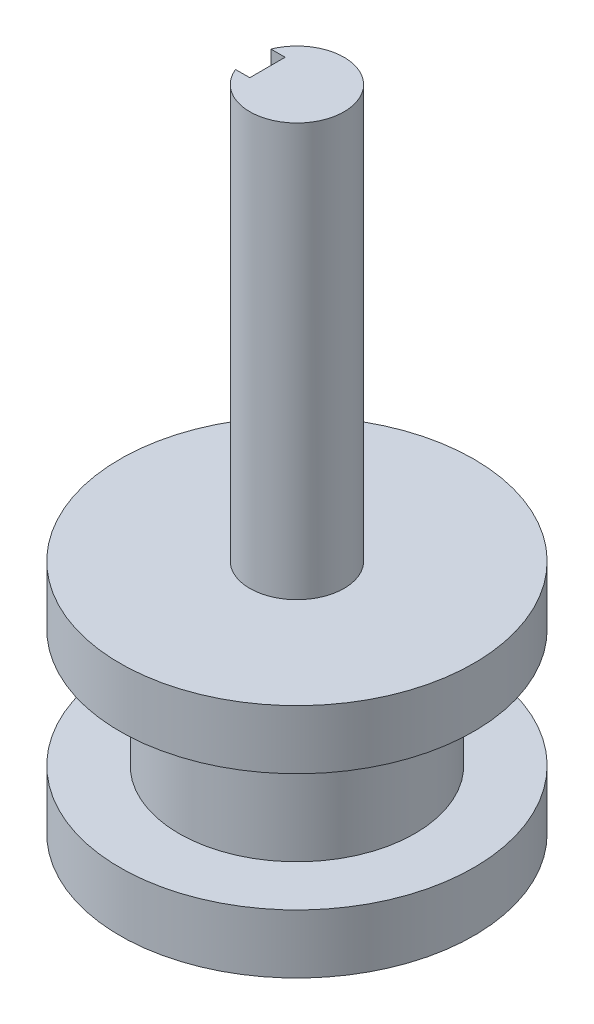
ISO-10303-21;
HEADER;
FILE_DESCRIPTION(('STEP AP214'),'2;1');
FILE_NAME('part.step','',(''),(''),'','','');
FILE_SCHEMA(('AUTOMOTIVE_DESIGN { 1 0 10303 214 1 1 1 1 }'));
ENDSEC;
DATA;
#1=APPLICATION_CONTEXT('core data for automotive mechanical design processes');
#2=APPLICATION_PROTOCOL_DEFINITION('international standard','automotive_design',2000,#1);
#3=PRODUCT_CONTEXT('',#1,'mechanical');
#4=PRODUCT('Part','Part','',(#3));
#5=PRODUCT_RELATED_PRODUCT_CATEGORY('part','',(#4));
#6=PRODUCT_DEFINITION_FORMATION('','',#4);
#7=PRODUCT_DEFINITION_CONTEXT('part definition',#1,'design');
#8=PRODUCT_DEFINITION('design','',#6,#7);
#9=PRODUCT_DEFINITION_SHAPE('','',#8);
#10=(LENGTH_UNIT() NAMED_UNIT(*) SI_UNIT(.MILLI.,.METRE.));
#11=(NAMED_UNIT(*) PLANE_ANGLE_UNIT() SI_UNIT($,.RADIAN.));
#12=(NAMED_UNIT(*) SI_UNIT($,.STERADIAN.) SOLID_ANGLE_UNIT());
#13=UNCERTAINTY_MEASURE_WITH_UNIT(LENGTH_MEASURE(1.E-05),#10,'distance_accuracy_value','');
#14=(GEOMETRIC_REPRESENTATION_CONTEXT(3) GLOBAL_UNCERTAINTY_ASSIGNED_CONTEXT((#13)) GLOBAL_UNIT_ASSIGNED_CONTEXT((#10,
#11,#12)) REPRESENTATION_CONTEXT('',''));
#15=CARTESIAN_POINT('',(0.,0.,0.));
#16=DIRECTION('',(0.,0.,1.));
#17=DIRECTION('',(1.,0.,0.));
#18=AXIS2_PLACEMENT_3D('',#15,#16,#17);
#19=CARTESIAN_POINT('',(0.,35.,0.));
#20=DIRECTION('',(0.,-1.,0.));
#21=DIRECTION('',(0.,0.,-1.));
#22=AXIS2_PLACEMENT_3D('',#19,#20,#21);
#23=CYLINDRICAL_SURFACE('',#22,4.);
#24=CARTESIAN_POINT('',(0.,35.,0.));
#25=DIRECTION('',(0.,1.,0.));
#26=DIRECTION('',(0.,0.,1.));
#27=AXIS2_PLACEMENT_3D('',#24,#25,#26);
#28=CIRCLE('',#27,4.);
#29=CARTESIAN_POINT('',(-3.70809924354783,35.,1.5));
#30=VERTEX_POINT('',#29);
#31=CARTESIAN_POINT('',(-3.70809924354783,35.,-1.5));
#32=VERTEX_POINT('',#31);
#33=EDGE_CURVE('E127',#30,#32,#28,.T.);
#34=ORIENTED_EDGE('',*,*,#33,.F.);
#35=DIRECTION('',(0.,-1.,0.));
#36=VECTOR('',#35,1.);
#37=CARTESIAN_POINT('',(-3.70809924354783,35.,1.5));
#38=LINE('',#37,#36);
#39=CARTESIAN_POINT('',(-3.70809924354783,30.,1.5));
#40=VERTEX_POINT('',#39);
#41=EDGE_CURVE('E123',#30,#40,#38,.T.);
#42=ORIENTED_EDGE('',*,*,#41,.T.);
#43=CARTESIAN_POINT('',(0.,30.,0.));
#44=DIRECTION('',(0.,1.,0.));
#45=DIRECTION('',(0.,0.,1.));
#46=AXIS2_PLACEMENT_3D('',#43,#44,#45);
#47=CIRCLE('',#46,4.);
#48=CARTESIAN_POINT('',(-3.70809924354783,30.,-1.5));
#49=VERTEX_POINT('',#48);
#50=EDGE_CURVE('E48',#49,#40,#47,.T.);
#51=ORIENTED_EDGE('',*,*,#50,.F.);
#52=DIRECTION('',(0.,-1.,0.));
#53=VECTOR('',#52,1.);
#54=CARTESIAN_POINT('',(-3.70809924354783,35.,-1.5));
#55=LINE('',#54,#53);
#56=EDGE_CURVE('E100',#49,#32,#55,.F.);
#57=ORIENTED_EDGE('',*,*,#56,.T.);
#58=EDGE_LOOP('',(#34,#42,#51,#57));
#59=FACE_BOUND('',#58,.T.);
#60=CARTESIAN_POINT('',(0.,0.,0.));
#61=DIRECTION('',(0.,1.,0.));
#62=DIRECTION('',(0.,0.,1.));
#63=AXIS2_PLACEMENT_3D('',#60,#61,#62);
#64=CIRCLE('',#63,4.);
#65=CARTESIAN_POINT('',(0.,0.,4.));
#66=VERTEX_POINT('',#65);
#67=EDGE_CURVE('E117',#66,#66,#64,.T.);
#68=ORIENTED_EDGE('',*,*,#67,.T.);
#69=EDGE_LOOP('',(#68));
#70=FACE_BOUND('',#69,.T.);
#71=ADVANCED_FACE('F45',(#59,#70),#23,.T.);
#72=CARTESIAN_POINT('',(0.,35.,0.));
#73=DIRECTION('',(0.,1.,0.));
#74=DIRECTION('',(0.,0.,1.));
#75=AXIS2_PLACEMENT_3D('',#72,#73,#74);
#76=PLANE('',#75);
#77=DIRECTION('',(1.,0.,0.));
#78=VECTOR('',#77,1.);
#79=CARTESIAN_POINT('',(0.,35.,1.5));
#80=LINE('',#79,#78);
#81=CARTESIAN_POINT('',(-2.5,35.,1.5));
#82=VERTEX_POINT('',#81);
#83=EDGE_CURVE('E131',#30,#82,#80,.T.);
#84=ORIENTED_EDGE('',*,*,#83,.F.);
#85=ORIENTED_EDGE('',*,*,#33,.T.);
#86=DIRECTION('',(-1.,0.,0.));
#87=VECTOR('',#86,1.);
#88=CARTESIAN_POINT('',(-5.5,35.,-1.5));
#89=LINE('',#88,#87);
#90=CARTESIAN_POINT('',(-2.5,35.,-1.5));
#91=VERTEX_POINT('',#90);
#92=EDGE_CURVE('E106',#91,#32,#89,.T.);
#93=ORIENTED_EDGE('',*,*,#92,.F.);
#94=DIRECTION('',(0.,0.,-1.));
#95=VECTOR('',#94,1.);
#96=CARTESIAN_POINT('',(-2.5,35.,-1.5));
#97=LINE('',#96,#95);
#98=EDGE_CURVE('E61',#82,#91,#97,.T.);
#99=ORIENTED_EDGE('',*,*,#98,.F.);
#100=EDGE_LOOP('',(#84,#85,#93,#99));
#101=FACE_BOUND('',#100,.T.);
#102=ADVANCED_FACE('F142',(#101),#76,.T.);
#103=CARTESIAN_POINT('',(0.,30.,0.));
#104=DIRECTION('',(0.,1.,0.));
#105=DIRECTION('',(0.,0.,1.));
#106=AXIS2_PLACEMENT_3D('',#103,#104,#105);
#107=PLANE('',#106);
#108=ORIENTED_EDGE('',*,*,#50,.T.);
#109=DIRECTION('',(1.,0.,0.));
#110=VECTOR('',#109,1.);
#111=CARTESIAN_POINT('',(-5.5,30.,1.5));
#112=LINE('',#111,#110);
#113=CARTESIAN_POINT('',(-2.5,30.,1.5));
#114=VERTEX_POINT('',#113);
#115=EDGE_CURVE('E95',#40,#114,#112,.T.);
#116=ORIENTED_EDGE('',*,*,#115,.T.);
#117=DIRECTION('',(0.,0.,-1.));
#118=VECTOR('',#117,1.);
#119=CARTESIAN_POINT('',(-2.5,30.,-1.5));
#120=LINE('',#119,#118);
#121=CARTESIAN_POINT('',(-2.5,30.,-1.5));
#122=VERTEX_POINT('',#121);
#123=EDGE_CURVE('E90',#114,#122,#120,.T.);
#124=ORIENTED_EDGE('',*,*,#123,.T.);
#125=DIRECTION('',(-1.,0.,0.));
#126=VECTOR('',#125,1.);
#127=CARTESIAN_POINT('',(-5.5,30.,-1.5));
#128=LINE('',#127,#126);
#129=EDGE_CURVE('E97',#122,#49,#128,.T.);
#130=ORIENTED_EDGE('',*,*,#129,.T.);
#131=EDGE_LOOP('',(#108,#116,#124,#130));
#132=FACE_BOUND('',#131,.T.);
#133=ADVANCED_FACE('F103',(#132),#107,.T.);
#134=CARTESIAN_POINT('',(-5.5,30.,1.5));
#135=DIRECTION('',(0.,0.,1.));
#136=DIRECTION('',(1.,0.,0.));
#137=AXIS2_PLACEMENT_3D('',#134,#135,#136);
#138=PLANE('',#137);
#139=ORIENTED_EDGE('',*,*,#83,.T.);
#140=DIRECTION('',(0.,1.,0.));
#141=VECTOR('',#140,1.);
#142=CARTESIAN_POINT('',(-2.5,30.,1.5));
#143=LINE('',#142,#141);
#144=EDGE_CURVE('E94',#114,#82,#143,.T.);
#145=ORIENTED_EDGE('',*,*,#144,.F.);
#146=ORIENTED_EDGE('',*,*,#115,.F.);
#147=ORIENTED_EDGE('',*,*,#41,.F.);
#148=EDGE_LOOP('',(#139,#145,#146,#147));
#149=FACE_BOUND('',#148,.T.);
#150=ADVANCED_FACE('F139',(#149),#138,.F.);
#151=CARTESIAN_POINT('',(-5.5,30.,-1.5));
#152=DIRECTION('',(0.,0.,-1.));
#153=DIRECTION('',(-1.,0.,0.));
#154=AXIS2_PLACEMENT_3D('',#151,#152,#153);
#155=PLANE('',#154);
#156=ORIENTED_EDGE('',*,*,#129,.F.);
#157=DIRECTION('',(0.,1.,0.));
#158=VECTOR('',#157,1.);
#159=CARTESIAN_POINT('',(-2.5,30.,-1.5));
#160=LINE('',#159,#158);
#161=EDGE_CURVE('E86',#122,#91,#160,.T.);
#162=ORIENTED_EDGE('',*,*,#161,.T.);
#163=ORIENTED_EDGE('',*,*,#92,.T.);
#164=ORIENTED_EDGE('',*,*,#56,.F.);
#165=EDGE_LOOP('',(#156,#162,#163,#164));
#166=FACE_BOUND('',#165,.T.);
#167=ADVANCED_FACE('F98',(#166),#155,.F.);
#168=CARTESIAN_POINT('',(-2.5,30.,-1.5));
#169=DIRECTION('',(1.,0.,0.));
#170=DIRECTION('',(0.,0.,-1.));
#171=AXIS2_PLACEMENT_3D('',#168,#169,#170);
#172=PLANE('',#171);
#173=ORIENTED_EDGE('',*,*,#98,.T.);
#174=ORIENTED_EDGE('',*,*,#161,.F.);
#175=ORIENTED_EDGE('',*,*,#123,.F.);
#176=ORIENTED_EDGE('',*,*,#144,.T.);
#177=EDGE_LOOP('',(#173,#174,#175,#176));
#178=FACE_BOUND('',#177,.T.);
#179=ADVANCED_FACE('F88',(#178),#172,.F.);
#180=CARTESIAN_POINT('',(0.,-5.,0.));
#181=DIRECTION('',(0.,1.,0.));
#182=DIRECTION('',(0.,0.,1.));
#183=AXIS2_PLACEMENT_3D('',#180,#181,#182);
#184=CYLINDRICAL_SURFACE('',#183,15.);
#185=CARTESIAN_POINT('',(0.,-5.,0.));
#186=DIRECTION('',(0.,-1.,0.));
#187=DIRECTION('',(0.,0.,-1.));
#188=AXIS2_PLACEMENT_3D('',#185,#186,#187);
#189=CIRCLE('',#188,15.);
#190=CARTESIAN_POINT('',(0.,-5.,-15.));
#191=VERTEX_POINT('',#190);
#192=EDGE_CURVE('E134',#191,#191,#189,.T.);
#193=ORIENTED_EDGE('',*,*,#192,.F.);
#194=EDGE_LOOP('',(#193));
#195=FACE_BOUND('',#194,.T.);
#196=CARTESIAN_POINT('',(0.,0.,0.));
#197=DIRECTION('',(0.,-1.,0.));
#198=DIRECTION('',(0.,0.,-1.));
#199=AXIS2_PLACEMENT_3D('',#196,#197,#198);
#200=CIRCLE('',#199,15.);
#201=CARTESIAN_POINT('',(0.,0.,-15.));
#202=VERTEX_POINT('',#201);
#203=EDGE_CURVE('E111',#202,#202,#200,.T.);
#204=ORIENTED_EDGE('',*,*,#203,.T.);
#205=EDGE_LOOP('',(#204));
#206=FACE_BOUND('',#205,.T.);
#207=ADVANCED_FACE('F195',(#195,#206),#184,.T.);
#208=CARTESIAN_POINT('',(0.,-5.,0.));
#209=DIRECTION('',(0.,-1.,0.));
#210=DIRECTION('',(0.,0.,-1.));
#211=AXIS2_PLACEMENT_3D('',#208,#209,#210);
#212=PLANE('',#211);
#213=CARTESIAN_POINT('',(0.,-5.,0.));
#214=DIRECTION('',(0.,-1.,0.));
#215=DIRECTION('',(0.,0.,-1.));
#216=AXIS2_PLACEMENT_3D('',#213,#214,#215);
#217=CIRCLE('',#216,10.);
#218=CARTESIAN_POINT('',(0.,-5.,-10.));
#219=VERTEX_POINT('',#218);
#220=EDGE_CURVE('E11',#219,#219,#217,.T.);
#221=ORIENTED_EDGE('',*,*,#220,.F.);
#222=EDGE_LOOP('',(#221));
#223=FACE_BOUND('',#222,.T.);
#224=ORIENTED_EDGE('',*,*,#192,.T.);
#225=EDGE_LOOP('',(#224));
#226=FACE_BOUND('',#225,.T.);
#227=ADVANCED_FACE('F152',(#223,#226),#212,.T.);
#228=CARTESIAN_POINT('',(0.,0.,0.));
#229=DIRECTION('',(0.,-1.,0.));
#230=DIRECTION('',(0.,0.,-1.));
#231=AXIS2_PLACEMENT_3D('',#228,#229,#230);
#232=PLANE('',#231);
#233=ORIENTED_EDGE('',*,*,#67,.F.);
#234=EDGE_LOOP('',(#233));
#235=FACE_BOUND('',#234,.T.);
#236=ORIENTED_EDGE('',*,*,#203,.F.);
#237=EDGE_LOOP('',(#236));
#238=FACE_BOUND('',#237,.T.);
#239=ADVANCED_FACE('F148',(#235,#238),#232,.F.);
#240=CARTESIAN_POINT('',(0.,-15.,0.));
#241=DIRECTION('',(0.,1.,0.));
#242=DIRECTION('',(0.,0.,1.));
#243=AXIS2_PLACEMENT_3D('',#240,#241,#242);
#244=CYLINDRICAL_SURFACE('',#243,10.);
#245=CARTESIAN_POINT('',(0.,-15.,0.));
#246=DIRECTION('',(0.,-1.,0.));
#247=DIRECTION('',(0.,0.,-1.));
#248=AXIS2_PLACEMENT_3D('',#245,#246,#247);
#249=CIRCLE('',#248,10.);
#250=CARTESIAN_POINT('',(0.,-15.,-10.));
#251=VERTEX_POINT('',#250);
#252=EDGE_CURVE('E158',#251,#251,#249,.T.);
#253=ORIENTED_EDGE('',*,*,#252,.F.);
#254=EDGE_LOOP('',(#253));
#255=FACE_BOUND('',#254,.T.);
#256=ORIENTED_EDGE('',*,*,#220,.T.);
#257=EDGE_LOOP('',(#256));
#258=FACE_BOUND('',#257,.T.);
#259=ADVANCED_FACE('F151',(#255,#258),#244,.T.);
#260=CARTESIAN_POINT('',(0.,-20.,0.));
#261=DIRECTION('',(0.,1.,0.));
#262=DIRECTION('',(0.,0.,1.));
#263=AXIS2_PLACEMENT_3D('',#260,#261,#262);
#264=CYLINDRICAL_SURFACE('',#263,15.);
#265=CARTESIAN_POINT('',(0.,-20.,0.));
#266=DIRECTION('',(0.,-1.,0.));
#267=DIRECTION('',(0.,0.,-1.));
#268=AXIS2_PLACEMENT_3D('',#265,#266,#267);
#269=CIRCLE('',#268,15.);
#270=CARTESIAN_POINT('',(0.,-20.,-15.));
#271=VERTEX_POINT('',#270);
#272=EDGE_CURVE('E163',#271,#271,#269,.T.);
#273=ORIENTED_EDGE('',*,*,#272,.F.);
#274=EDGE_LOOP('',(#273));
#275=FACE_BOUND('',#274,.T.);
#276=CARTESIAN_POINT('',(0.,-15.,0.));
#277=DIRECTION('',(0.,-1.,0.));
#278=DIRECTION('',(0.,0.,-1.));
#279=AXIS2_PLACEMENT_3D('',#276,#277,#278);
#280=CIRCLE('',#279,15.);
#281=CARTESIAN_POINT('',(0.,-15.,-15.));
#282=VERTEX_POINT('',#281);
#283=EDGE_CURVE('E169',#282,#282,#280,.T.);
#284=ORIENTED_EDGE('',*,*,#283,.T.);
#285=EDGE_LOOP('',(#284));
#286=FACE_BOUND('',#285,.T.);
#287=ADVANCED_FACE('F176',(#275,#286),#264,.T.);
#288=CARTESIAN_POINT('',(0.,-20.,0.));
#289=DIRECTION('',(0.,-1.,0.));
#290=DIRECTION('',(0.,0.,-1.));
#291=AXIS2_PLACEMENT_3D('',#288,#289,#290);
#292=PLANE('',#291);
#293=ORIENTED_EDGE('',*,*,#272,.T.);
#294=EDGE_LOOP('',(#293));
#295=FACE_BOUND('',#294,.T.);
#296=ADVANCED_FACE('F180',(#295),#292,.T.);
#297=CARTESIAN_POINT('',(0.,-15.,0.));
#298=DIRECTION('',(0.,-1.,0.));
#299=DIRECTION('',(0.,0.,-1.));
#300=AXIS2_PLACEMENT_3D('',#297,#298,#299);
#301=PLANE('',#300);
#302=ORIENTED_EDGE('',*,*,#252,.T.);
#303=EDGE_LOOP('',(#302));
#304=FACE_BOUND('',#303,.T.);
#305=ORIENTED_EDGE('',*,*,#283,.F.);
#306=EDGE_LOOP('',(#305));
#307=FACE_BOUND('',#306,.T.);
#308=ADVANCED_FACE('F178',(#304,#307),#301,.F.);
#309=CLOSED_SHELL('',(#71,#102,#133,#150,#167,#179,#207,#227,#239,#259,#287,#296,#308));
#310=MANIFOLD_SOLID_BREP('B2',#309);
#311=ADVANCED_BREP_SHAPE_REPRESENTATION('',(#18,#310),#14);
#312=SHAPE_DEFINITION_REPRESENTATION(#9,#311);
ENDSEC;
END-ISO-10303-21;
